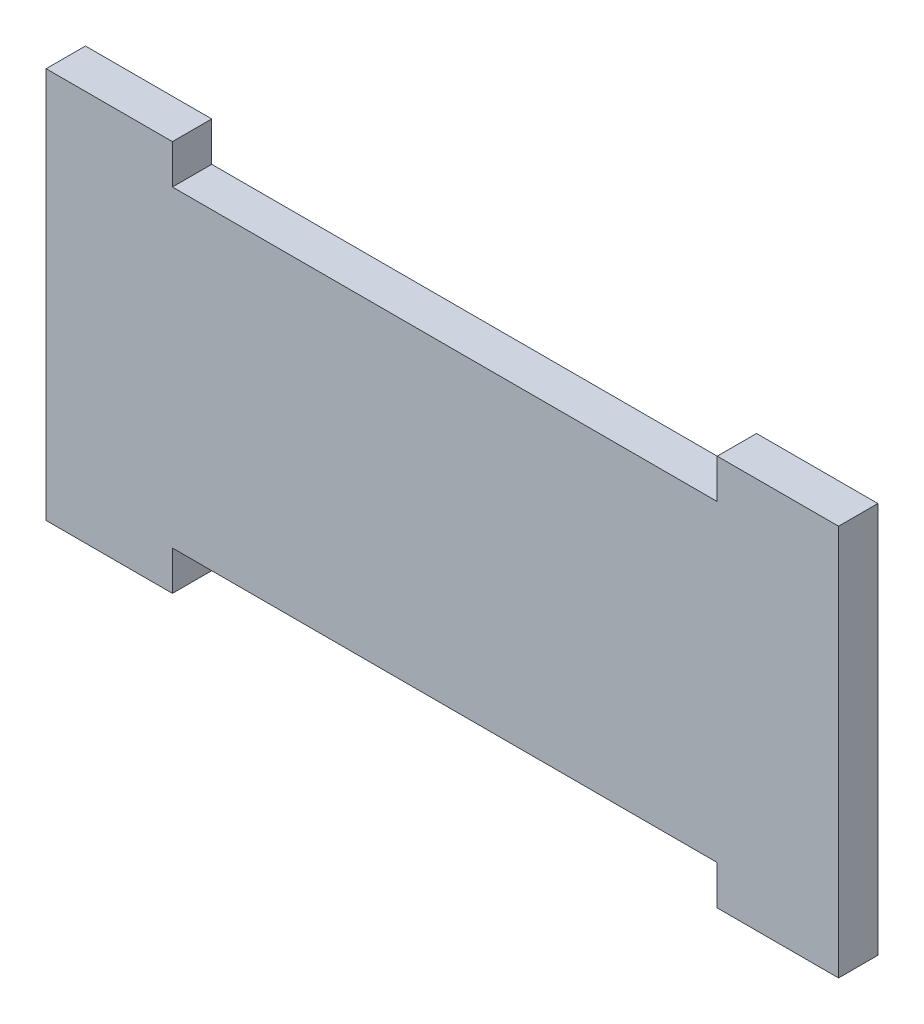
ISO-10303-21;
HEADER;
FILE_DESCRIPTION(('STEP AP214'),'2;1');
FILE_NAME('part.step','',(''),(''),'','','');
FILE_SCHEMA(('AUTOMOTIVE_DESIGN { 1 0 10303 214 1 1 1 1 }'));
ENDSEC;
DATA;
#1=APPLICATION_CONTEXT('core data for automotive mechanical design processes');
#2=APPLICATION_PROTOCOL_DEFINITION('international standard','automotive_design',2000,#1);
#3=PRODUCT_CONTEXT('',#1,'mechanical');
#4=PRODUCT('Part','Part','',(#3));
#5=PRODUCT_RELATED_PRODUCT_CATEGORY('part','',(#4));
#6=PRODUCT_DEFINITION_FORMATION('','',#4);
#7=PRODUCT_DEFINITION_CONTEXT('part definition',#1,'design');
#8=PRODUCT_DEFINITION('design','',#6,#7);
#9=PRODUCT_DEFINITION_SHAPE('','',#8);
#10=(LENGTH_UNIT() NAMED_UNIT(*) SI_UNIT(.MILLI.,.METRE.));
#11=(NAMED_UNIT(*) PLANE_ANGLE_UNIT() SI_UNIT($,.RADIAN.));
#12=(NAMED_UNIT(*) SI_UNIT($,.STERADIAN.) SOLID_ANGLE_UNIT());
#13=UNCERTAINTY_MEASURE_WITH_UNIT(LENGTH_MEASURE(1.E-05),#10,'distance_accuracy_value','');
#14=(GEOMETRIC_REPRESENTATION_CONTEXT(3) GLOBAL_UNCERTAINTY_ASSIGNED_CONTEXT((#13)) GLOBAL_UNIT_ASSIGNED_CONTEXT((#10,
#11,#12)) REPRESENTATION_CONTEXT('',''));
#15=CARTESIAN_POINT('',(0.,0.,0.));
#16=DIRECTION('',(0.,0.,1.));
#17=DIRECTION('',(1.,0.,0.));
#18=AXIS2_PLACEMENT_3D('',#15,#16,#17);
#19=CARTESIAN_POINT('',(0.,-1.5875,1.5875));
#20=DIRECTION('',(0.,1.,0.));
#21=DIRECTION('',(0.,0.,1.));
#22=AXIS2_PLACEMENT_3D('',#19,#20,#21);
#23=PLANE('',#22);
#24=DIRECTION('',(1.,0.,0.));
#25=VECTOR('',#24,1.);
#26=CARTESIAN_POINT('',(0.,-1.5875,0.));
#27=LINE('',#26,#25);
#28=CARTESIAN_POINT('',(-45.9,-1.5875,0.));
#29=VERTEX_POINT('',#28);
#30=CARTESIAN_POINT('',(-23.9,-1.5875,0.));
#31=VERTEX_POINT('',#30);
#32=EDGE_CURVE('E250',#29,#31,#27,.T.);
#33=ORIENTED_EDGE('',*,*,#32,.F.);
#34=DIRECTION('',(0.,0.,-1.));
#35=VECTOR('',#34,1.);
#36=CARTESIAN_POINT('',(-45.9,-1.5875,1.5875));
#37=LINE('',#36,#35);
#38=CARTESIAN_POINT('',(-45.9,-1.5875,1.5875));
#39=VERTEX_POINT('',#38);
#40=EDGE_CURVE('E12',#39,#29,#37,.T.);
#41=ORIENTED_EDGE('',*,*,#40,.F.);
#42=DIRECTION('',(1.,0.,0.));
#43=VECTOR('',#42,1.);
#44=CARTESIAN_POINT('',(0.,-1.5875,1.5875));
#45=LINE('',#44,#43);
#46=CARTESIAN_POINT('',(-23.9,-1.5875,1.5875));
#47=VERTEX_POINT('',#46);
#48=EDGE_CURVE('E203',#39,#47,#45,.T.);
#49=ORIENTED_EDGE('',*,*,#48,.T.);
#50=DIRECTION('',(0.,0.,-1.));
#51=VECTOR('',#50,1.);
#52=CARTESIAN_POINT('',(-23.9,-1.5875,1.5875));
#53=LINE('',#52,#51);
#54=EDGE_CURVE('E104',#47,#31,#53,.T.);
#55=ORIENTED_EDGE('',*,*,#54,.T.);
#56=EDGE_LOOP('',(#33,#41,#49,#55));
#57=FACE_BOUND('',#56,.T.);
#58=ADVANCED_FACE('F42',(#57),#23,.T.);
#59=CARTESIAN_POINT('',(-45.9,0.,1.5875));
#60=DIRECTION('',(-1.,0.,0.));
#61=DIRECTION('',(0.,0.,1.));
#62=AXIS2_PLACEMENT_3D('',#59,#60,#61);
#63=PLANE('',#62);
#64=DIRECTION('',(0.,1.,0.));
#65=VECTOR('',#64,1.);
#66=CARTESIAN_POINT('',(-45.9,0.,0.));
#67=LINE('',#66,#65);
#68=CARTESIAN_POINT('',(-45.9,0.,0.));
#69=VERTEX_POINT('',#68);
#70=EDGE_CURVE('E243',#29,#69,#67,.T.);
#71=ORIENTED_EDGE('',*,*,#70,.T.);
#72=DIRECTION('',(0.,0.,-1.));
#73=VECTOR('',#72,1.);
#74=CARTESIAN_POINT('',(-45.9,0.,1.5875));
#75=LINE('',#74,#73);
#76=CARTESIAN_POINT('',(-45.9,0.,1.5875));
#77=VERTEX_POINT('',#76);
#78=EDGE_CURVE('E50',#77,#69,#75,.T.);
#79=ORIENTED_EDGE('',*,*,#78,.F.);
#80=DIRECTION('',(0.,1.,0.));
#81=VECTOR('',#80,1.);
#82=CARTESIAN_POINT('',(-45.9,0.,1.5875));
#83=LINE('',#82,#81);
#84=EDGE_CURVE('E199',#39,#77,#83,.T.);
#85=ORIENTED_EDGE('',*,*,#84,.F.);
#86=ORIENTED_EDGE('',*,*,#40,.T.);
#87=EDGE_LOOP('',(#71,#79,#85,#86));
#88=FACE_BOUND('',#87,.T.);
#89=ADVANCED_FACE('F270',(#88),#63,.F.);
#90=CARTESIAN_POINT('',(0.,0.,1.5875));
#91=DIRECTION('',(0.,-1.,0.));
#92=DIRECTION('',(1.,0.,0.));
#93=AXIS2_PLACEMENT_3D('',#90,#91,#92);
#94=PLANE('',#93);
#95=DIRECTION('',(-1.,0.,0.));
#96=VECTOR('',#95,1.);
#97=CARTESIAN_POINT('',(0.,0.,0.));
#98=LINE('',#97,#96);
#99=CARTESIAN_POINT('',(-51.,0.,0.));
#100=VERTEX_POINT('',#99);
#101=EDGE_CURVE('E237',#69,#100,#98,.T.);
#102=ORIENTED_EDGE('',*,*,#101,.T.);
#103=DIRECTION('',(0.,0.,-1.));
#104=VECTOR('',#103,1.);
#105=CARTESIAN_POINT('',(-51.,0.,1.5875));
#106=LINE('',#105,#104);
#107=CARTESIAN_POINT('',(-51.,0.,1.5875));
#108=VERTEX_POINT('',#107);
#109=EDGE_CURVE('E228',#108,#100,#106,.T.);
#110=ORIENTED_EDGE('',*,*,#109,.F.);
#111=DIRECTION('',(-1.,0.,0.));
#112=VECTOR('',#111,1.);
#113=CARTESIAN_POINT('',(0.,0.,1.5875));
#114=LINE('',#113,#112);
#115=EDGE_CURVE('E195',#77,#108,#114,.T.);
#116=ORIENTED_EDGE('',*,*,#115,.F.);
#117=ORIENTED_EDGE('',*,*,#78,.T.);
#118=EDGE_LOOP('',(#102,#110,#116,#117));
#119=FACE_BOUND('',#118,.T.);
#120=ADVANCED_FACE('F235',(#119),#94,.F.);
#121=CARTESIAN_POINT('',(-51.,0.,1.5875));
#122=DIRECTION('',(1.,0.,0.));
#123=DIRECTION('',(0.,0.,-1.));
#124=AXIS2_PLACEMENT_3D('',#121,#122,#123);
#125=PLANE('',#124);
#126=DIRECTION('',(0.,-1.,0.));
#127=VECTOR('',#126,1.);
#128=CARTESIAN_POINT('',(-51.,0.,0.));
#129=LINE('',#128,#127);
#130=CARTESIAN_POINT('',(-51.,-15.8,0.));
#131=VERTEX_POINT('',#130);
#132=EDGE_CURVE('E246',#100,#131,#129,.T.);
#133=ORIENTED_EDGE('',*,*,#132,.T.);
#134=DIRECTION('',(0.,0.,-1.));
#135=VECTOR('',#134,1.);
#136=CARTESIAN_POINT('',(-51.,-15.8,1.5875));
#137=LINE('',#136,#135);
#138=CARTESIAN_POINT('',(-51.,-15.8,1.5875));
#139=VERTEX_POINT('',#138);
#140=EDGE_CURVE('E226',#139,#131,#137,.T.);
#141=ORIENTED_EDGE('',*,*,#140,.F.);
#142=DIRECTION('',(0.,-1.,0.));
#143=VECTOR('',#142,1.);
#144=CARTESIAN_POINT('',(-51.,0.,1.5875));
#145=LINE('',#144,#143);
#146=EDGE_CURVE('E192',#108,#139,#145,.T.);
#147=ORIENTED_EDGE('',*,*,#146,.F.);
#148=ORIENTED_EDGE('',*,*,#109,.T.);
#149=EDGE_LOOP('',(#133,#141,#147,#148));
#150=FACE_BOUND('',#149,.T.);
#151=ADVANCED_FACE('F277',(#150),#125,.F.);
#152=CARTESIAN_POINT('',(0.,-15.8,1.5875));
#153=DIRECTION('',(0.,-1.,0.));
#154=DIRECTION('',(0.,0.,-1.));
#155=AXIS2_PLACEMENT_3D('',#152,#153,#154);
#156=PLANE('',#155);
#157=DIRECTION('',(-1.,0.,0.));
#158=VECTOR('',#157,1.);
#159=CARTESIAN_POINT('',(0.,-15.8,0.));
#160=LINE('',#159,#158);
#161=CARTESIAN_POINT('',(-45.9,-15.8,0.));
#162=VERTEX_POINT('',#161);
#163=EDGE_CURVE('E248',#162,#131,#160,.T.);
#164=ORIENTED_EDGE('',*,*,#163,.F.);
#165=DIRECTION('',(0.,0.,-1.));
#166=VECTOR('',#165,1.);
#167=CARTESIAN_POINT('',(-45.9,-15.8,1.5875));
#168=LINE('',#167,#166);
#169=CARTESIAN_POINT('',(-45.9,-15.8,1.5875));
#170=VERTEX_POINT('',#169);
#171=EDGE_CURVE('E224',#170,#162,#168,.T.);
#172=ORIENTED_EDGE('',*,*,#171,.F.);
#173=DIRECTION('',(-1.,0.,0.));
#174=VECTOR('',#173,1.);
#175=CARTESIAN_POINT('',(0.,-15.8,1.5875));
#176=LINE('',#175,#174);
#177=EDGE_CURVE('E184',#170,#139,#176,.T.);
#178=ORIENTED_EDGE('',*,*,#177,.T.);
#179=ORIENTED_EDGE('',*,*,#140,.T.);
#180=EDGE_LOOP('',(#164,#172,#178,#179));
#181=FACE_BOUND('',#180,.T.);
#182=ADVANCED_FACE('F282',(#181),#156,.T.);
#183=CARTESIAN_POINT('',(-45.9,0.,1.5875));
#184=DIRECTION('',(1.,0.,0.));
#185=DIRECTION('',(0.,0.,-1.));
#186=AXIS2_PLACEMENT_3D('',#183,#184,#185);
#187=PLANE('',#186);
#188=DIRECTION('',(0.,-1.,0.));
#189=VECTOR('',#188,1.);
#190=CARTESIAN_POINT('',(-45.9,0.,0.));
#191=LINE('',#190,#189);
#192=CARTESIAN_POINT('',(-45.9,-14.2125,0.));
#193=VERTEX_POINT('',#192);
#194=EDGE_CURVE('E255',#193,#162,#191,.T.);
#195=ORIENTED_EDGE('',*,*,#194,.F.);
#196=DIRECTION('',(0.,0.,-1.));
#197=VECTOR('',#196,1.);
#198=CARTESIAN_POINT('',(-45.9,-14.2125,1.5875));
#199=LINE('',#198,#197);
#200=CARTESIAN_POINT('',(-45.9,-14.2125,1.5875));
#201=VERTEX_POINT('',#200);
#202=EDGE_CURVE('E222',#201,#193,#199,.T.);
#203=ORIENTED_EDGE('',*,*,#202,.F.);
#204=DIRECTION('',(0.,-1.,0.));
#205=VECTOR('',#204,1.);
#206=CARTESIAN_POINT('',(-45.9,0.,1.5875));
#207=LINE('',#206,#205);
#208=EDGE_CURVE('E179',#201,#170,#207,.T.);
#209=ORIENTED_EDGE('',*,*,#208,.T.);
#210=ORIENTED_EDGE('',*,*,#171,.T.);
#211=EDGE_LOOP('',(#195,#203,#209,#210));
#212=FACE_BOUND('',#211,.T.);
#213=ADVANCED_FACE('F286',(#212),#187,.T.);
#214=CARTESIAN_POINT('',(0.,-14.2125,1.5875));
#215=DIRECTION('',(0.,-1.,0.));
#216=DIRECTION('',(0.,0.,-1.));
#217=AXIS2_PLACEMENT_3D('',#214,#215,#216);
#218=PLANE('',#217);
#219=DIRECTION('',(-1.,0.,0.));
#220=VECTOR('',#219,1.);
#221=CARTESIAN_POINT('',(0.,-14.2125,0.));
#222=LINE('',#221,#220);
#223=CARTESIAN_POINT('',(-23.9,-14.2125,0.));
#224=VERTEX_POINT('',#223);
#225=EDGE_CURVE('E258',#224,#193,#222,.T.);
#226=ORIENTED_EDGE('',*,*,#225,.F.);
#227=DIRECTION('',(0.,0.,-1.));
#228=VECTOR('',#227,1.);
#229=CARTESIAN_POINT('',(-23.9,-14.2125,1.5875));
#230=LINE('',#229,#228);
#231=CARTESIAN_POINT('',(-23.9,-14.2125,1.5875));
#232=VERTEX_POINT('',#231);
#233=EDGE_CURVE('E220',#232,#224,#230,.T.);
#234=ORIENTED_EDGE('',*,*,#233,.F.);
#235=DIRECTION('',(-1.,0.,0.));
#236=VECTOR('',#235,1.);
#237=CARTESIAN_POINT('',(0.,-14.2125,1.5875));
#238=LINE('',#237,#236);
#239=EDGE_CURVE('E174',#232,#201,#238,.T.);
#240=ORIENTED_EDGE('',*,*,#239,.T.);
#241=ORIENTED_EDGE('',*,*,#202,.T.);
#242=EDGE_LOOP('',(#226,#234,#240,#241));
#243=FACE_BOUND('',#242,.T.);
#244=ADVANCED_FACE('F290',(#243),#218,.T.);
#245=CARTESIAN_POINT('',(-23.9,0.,1.5875));
#246=DIRECTION('',(-1.,0.,0.));
#247=DIRECTION('',(0.,0.,1.));
#248=AXIS2_PLACEMENT_3D('',#245,#246,#247);
#249=PLANE('',#248);
#250=DIRECTION('',(0.,1.,0.));
#251=VECTOR('',#250,1.);
#252=CARTESIAN_POINT('',(-23.9,0.,0.));
#253=LINE('',#252,#251);
#254=CARTESIAN_POINT('',(-23.9,-15.8,0.));
#255=VERTEX_POINT('',#254);
#256=EDGE_CURVE('E261',#255,#224,#253,.T.);
#257=ORIENTED_EDGE('',*,*,#256,.F.);
#258=DIRECTION('',(0.,0.,-1.));
#259=VECTOR('',#258,1.);
#260=CARTESIAN_POINT('',(-23.9,-15.8,1.5875));
#261=LINE('',#260,#259);
#262=CARTESIAN_POINT('',(-23.9,-15.8,1.5875));
#263=VERTEX_POINT('',#262);
#264=EDGE_CURVE('E218',#263,#255,#261,.T.);
#265=ORIENTED_EDGE('',*,*,#264,.F.);
#266=DIRECTION('',(0.,1.,0.));
#267=VECTOR('',#266,1.);
#268=CARTESIAN_POINT('',(-23.9,0.,1.5875));
#269=LINE('',#268,#267);
#270=EDGE_CURVE('E159',#263,#232,#269,.T.);
#271=ORIENTED_EDGE('',*,*,#270,.T.);
#272=ORIENTED_EDGE('',*,*,#233,.T.);
#273=EDGE_LOOP('',(#257,#265,#271,#272));
#274=FACE_BOUND('',#273,.T.);
#275=ADVANCED_FACE('F294',(#274),#249,.T.);
#276=CARTESIAN_POINT('',(0.,-15.7999999999999,1.5875));
#277=DIRECTION('',(0.,-1.,0.));
#278=DIRECTION('',(1.,0.,0.));
#279=AXIS2_PLACEMENT_3D('',#276,#277,#278);
#280=PLANE('',#279);
#281=DIRECTION('',(-1.,0.,0.));
#282=VECTOR('',#281,1.);
#283=CARTESIAN_POINT('',(0.,-15.7999999999999,0.));
#284=LINE('',#283,#282);
#285=CARTESIAN_POINT('',(-19.,-15.8,0.));
#286=VERTEX_POINT('',#285);
#287=EDGE_CURVE('E264',#286,#255,#284,.T.);
#288=ORIENTED_EDGE('',*,*,#287,.F.);
#289=DIRECTION('',(0.,0.,-1.));
#290=VECTOR('',#289,1.);
#291=CARTESIAN_POINT('',(-19.,-15.8,1.5875));
#292=LINE('',#291,#290);
#293=CARTESIAN_POINT('',(-19.,-15.8,1.5875));
#294=VERTEX_POINT('',#293);
#295=EDGE_CURVE('E144',#294,#286,#292,.T.);
#296=ORIENTED_EDGE('',*,*,#295,.F.);
#297=DIRECTION('',(-1.,0.,0.));
#298=VECTOR('',#297,1.);
#299=CARTESIAN_POINT('',(0.,-15.7999999999999,1.5875));
#300=LINE('',#299,#298);
#301=EDGE_CURVE('E155',#294,#263,#300,.T.);
#302=ORIENTED_EDGE('',*,*,#301,.T.);
#303=ORIENTED_EDGE('',*,*,#264,.T.);
#304=EDGE_LOOP('',(#288,#296,#302,#303));
#305=FACE_BOUND('',#304,.T.);
#306=ADVANCED_FACE('F298',(#305),#280,.T.);
#307=CARTESIAN_POINT('',(-19.,0.,1.5875));
#308=DIRECTION('',(1.,0.,0.));
#309=DIRECTION('',(0.,0.,-1.));
#310=AXIS2_PLACEMENT_3D('',#307,#308,#309);
#311=PLANE('',#310);
#312=DIRECTION('',(0.,-1.,0.));
#313=VECTOR('',#312,1.);
#314=CARTESIAN_POINT('',(-19.,0.,0.));
#315=LINE('',#314,#313);
#316=CARTESIAN_POINT('',(-19.,0.,0.));
#317=VERTEX_POINT('',#316);
#318=EDGE_CURVE('E143',#317,#286,#315,.T.);
#319=ORIENTED_EDGE('',*,*,#318,.F.);
#320=DIRECTION('',(0.,0.,-1.));
#321=VECTOR('',#320,1.);
#322=CARTESIAN_POINT('',(-19.,0.,1.5875));
#323=LINE('',#322,#321);
#324=CARTESIAN_POINT('',(-19.,0.,1.5875));
#325=VERTEX_POINT('',#324);
#326=EDGE_CURVE('E137',#325,#317,#323,.T.);
#327=ORIENTED_EDGE('',*,*,#326,.F.);
#328=DIRECTION('',(0.,-1.,0.));
#329=VECTOR('',#328,1.);
#330=CARTESIAN_POINT('',(-19.,0.,1.5875));
#331=LINE('',#330,#329);
#332=EDGE_CURVE('E141',#325,#294,#331,.T.);
#333=ORIENTED_EDGE('',*,*,#332,.T.);
#334=ORIENTED_EDGE('',*,*,#295,.T.);
#335=EDGE_LOOP('',(#319,#327,#333,#334));
#336=FACE_BOUND('',#335,.T.);
#337=ADVANCED_FACE('F139',(#336),#311,.T.);
#338=CARTESIAN_POINT('',(0.,0.,1.5875));
#339=DIRECTION('',(0.,-1.,0.));
#340=DIRECTION('',(1.,0.,0.));
#341=AXIS2_PLACEMENT_3D('',#338,#339,#340);
#342=PLANE('',#341);
#343=DIRECTION('',(-1.,0.,0.));
#344=VECTOR('',#343,1.);
#345=CARTESIAN_POINT('',(0.,0.,0.));
#346=LINE('',#345,#344);
#347=CARTESIAN_POINT('',(-23.9,0.,0.));
#348=VERTEX_POINT('',#347);
#349=EDGE_CURVE('E97',#317,#348,#346,.T.);
#350=ORIENTED_EDGE('',*,*,#349,.T.);
#351=DIRECTION('',(0.,0.,-1.));
#352=VECTOR('',#351,1.);
#353=CARTESIAN_POINT('',(-23.9,0.,1.5875));
#354=LINE('',#353,#352);
#355=CARTESIAN_POINT('',(-23.9,0.,1.5875));
#356=VERTEX_POINT('',#355);
#357=EDGE_CURVE('E145',#356,#348,#354,.T.);
#358=ORIENTED_EDGE('',*,*,#357,.F.);
#359=DIRECTION('',(-1.,0.,0.));
#360=VECTOR('',#359,1.);
#361=CARTESIAN_POINT('',(0.,0.,1.5875));
#362=LINE('',#361,#360);
#363=EDGE_CURVE('E147',#325,#356,#362,.T.);
#364=ORIENTED_EDGE('',*,*,#363,.F.);
#365=ORIENTED_EDGE('',*,*,#326,.T.);
#366=EDGE_LOOP('',(#350,#358,#364,#365));
#367=FACE_BOUND('',#366,.T.);
#368=ADVANCED_FACE('F148',(#367),#342,.F.);
#369=CARTESIAN_POINT('',(-23.9,0.,1.5875));
#370=DIRECTION('',(1.,0.,0.));
#371=DIRECTION('',(0.,0.,-1.));
#372=AXIS2_PLACEMENT_3D('',#369,#370,#371);
#373=PLANE('',#372);
#374=DIRECTION('',(0.,-1.,0.));
#375=VECTOR('',#374,1.);
#376=CARTESIAN_POINT('',(-23.9,0.,0.));
#377=LINE('',#376,#375);
#378=EDGE_CURVE('E207',#348,#31,#377,.T.);
#379=ORIENTED_EDGE('',*,*,#378,.T.);
#380=ORIENTED_EDGE('',*,*,#54,.F.);
#381=DIRECTION('',(0.,-1.,0.));
#382=VECTOR('',#381,1.);
#383=CARTESIAN_POINT('',(-23.9,0.,1.5875));
#384=LINE('',#383,#382);
#385=EDGE_CURVE('E58',#356,#47,#384,.T.);
#386=ORIENTED_EDGE('',*,*,#385,.F.);
#387=ORIENTED_EDGE('',*,*,#357,.T.);
#388=EDGE_LOOP('',(#379,#380,#386,#387));
#389=FACE_BOUND('',#388,.T.);
#390=ADVANCED_FACE('F307',(#389),#373,.F.);
#391=CARTESIAN_POINT('',(0.,0.,1.5875));
#392=DIRECTION('',(0.,0.,1.));
#393=DIRECTION('',(1.,0.,0.));
#394=AXIS2_PLACEMENT_3D('',#391,#392,#393);
#395=PLANE('',#394);
#396=ORIENTED_EDGE('',*,*,#48,.F.);
#397=ORIENTED_EDGE('',*,*,#84,.T.);
#398=ORIENTED_EDGE('',*,*,#115,.T.);
#399=ORIENTED_EDGE('',*,*,#146,.T.);
#400=ORIENTED_EDGE('',*,*,#177,.F.);
#401=ORIENTED_EDGE('',*,*,#208,.F.);
#402=ORIENTED_EDGE('',*,*,#239,.F.);
#403=ORIENTED_EDGE('',*,*,#270,.F.);
#404=ORIENTED_EDGE('',*,*,#301,.F.);
#405=ORIENTED_EDGE('',*,*,#332,.F.);
#406=ORIENTED_EDGE('',*,*,#363,.T.);
#407=ORIENTED_EDGE('',*,*,#385,.T.);
#408=EDGE_LOOP('',(#396,#397,#398,#399,#400,#401,#402,#403,#404,#405,#406,#407));
#409=FACE_BOUND('',#408,.T.);
#410=ADVANCED_FACE('F152',(#409),#395,.T.);
#411=CARTESIAN_POINT('',(0.,0.,0.));
#412=DIRECTION('',(0.,0.,1.));
#413=DIRECTION('',(1.,0.,0.));
#414=AXIS2_PLACEMENT_3D('',#411,#412,#413);
#415=PLANE('',#414);
#416=ORIENTED_EDGE('',*,*,#32,.T.);
#417=ORIENTED_EDGE('',*,*,#378,.F.);
#418=ORIENTED_EDGE('',*,*,#349,.F.);
#419=ORIENTED_EDGE('',*,*,#318,.T.);
#420=ORIENTED_EDGE('',*,*,#287,.T.);
#421=ORIENTED_EDGE('',*,*,#256,.T.);
#422=ORIENTED_EDGE('',*,*,#225,.T.);
#423=ORIENTED_EDGE('',*,*,#194,.T.);
#424=ORIENTED_EDGE('',*,*,#163,.T.);
#425=ORIENTED_EDGE('',*,*,#132,.F.);
#426=ORIENTED_EDGE('',*,*,#101,.F.);
#427=ORIENTED_EDGE('',*,*,#70,.F.);
#428=EDGE_LOOP('',(#416,#417,#418,#419,#420,#421,#422,#423,#424,#425,#426,#427));
#429=FACE_BOUND('',#428,.T.);
#430=ADVANCED_FACE('F242',(#429),#415,.F.);
#431=CLOSED_SHELL('',(#58,#89,#120,#151,#182,#213,#244,#275,#306,#337,#368,#390,#410,#430));
#432=MANIFOLD_SOLID_BREP('B2',#431);
#433=ADVANCED_BREP_SHAPE_REPRESENTATION('',(#18,#432),#14);
#434=SHAPE_DEFINITION_REPRESENTATION(#9,#433);
ENDSEC;
END-ISO-10303-21;
